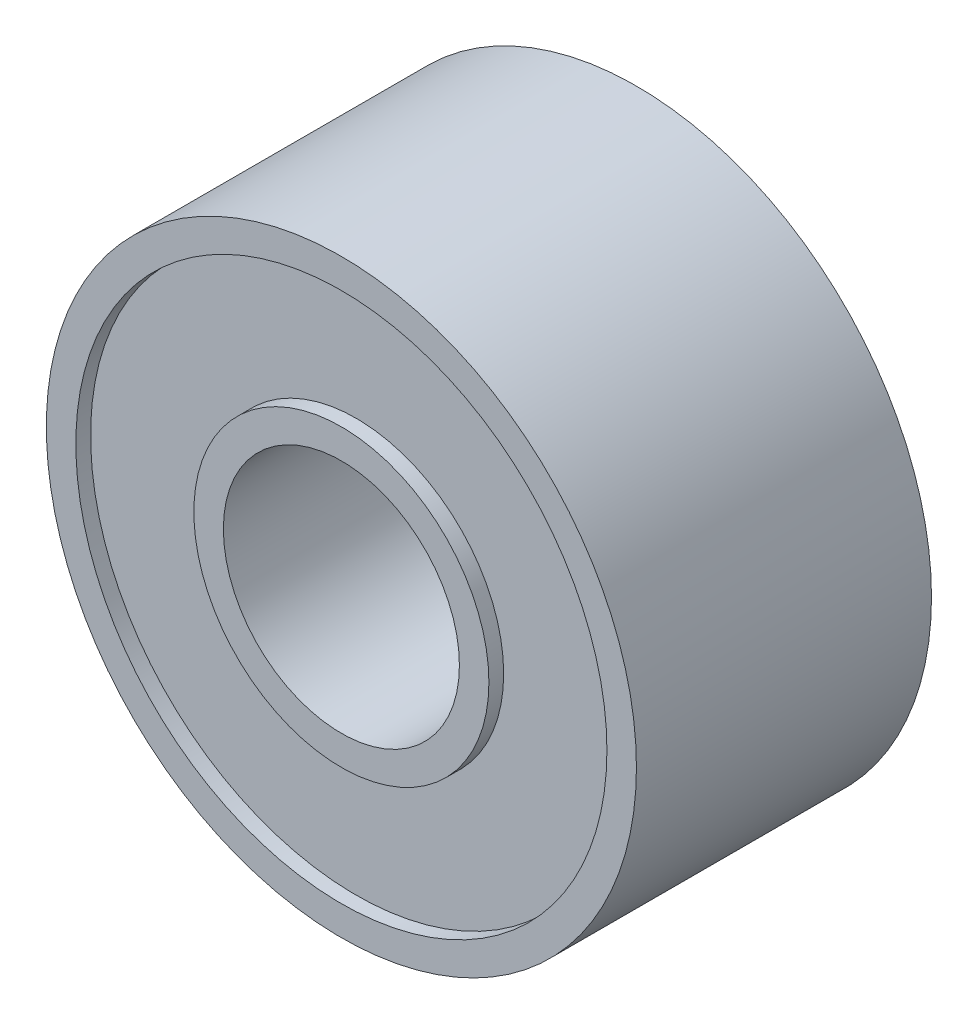
ISO-10303-21;
HEADER;
FILE_DESCRIPTION(('STEP AP214'),'2;1');
FILE_NAME('part.step','',(''),(''),'','','');
FILE_SCHEMA(('AUTOMOTIVE_DESIGN { 1 0 10303 214 1 1 1 1 }'));
ENDSEC;
DATA;
#1=APPLICATION_CONTEXT('core data for automotive mechanical design processes');
#2=APPLICATION_PROTOCOL_DEFINITION('international standard','automotive_design',2000,#1);
#3=PRODUCT_CONTEXT('',#1,'mechanical');
#4=PRODUCT('Part','Part','',(#3));
#5=PRODUCT_RELATED_PRODUCT_CATEGORY('part','',(#4));
#6=PRODUCT_DEFINITION_FORMATION('','',#4);
#7=PRODUCT_DEFINITION_CONTEXT('part definition',#1,'design');
#8=PRODUCT_DEFINITION('design','',#6,#7);
#9=PRODUCT_DEFINITION_SHAPE('','',#8);
#10=(LENGTH_UNIT() NAMED_UNIT(*) SI_UNIT(.MILLI.,.METRE.));
#11=(NAMED_UNIT(*) PLANE_ANGLE_UNIT() SI_UNIT($,.RADIAN.));
#12=(NAMED_UNIT(*) SI_UNIT($,.STERADIAN.) SOLID_ANGLE_UNIT());
#13=UNCERTAINTY_MEASURE_WITH_UNIT(LENGTH_MEASURE(1.E-05),#10,'distance_accuracy_value','');
#14=(GEOMETRIC_REPRESENTATION_CONTEXT(3) GLOBAL_UNCERTAINTY_ASSIGNED_CONTEXT((#13)) GLOBAL_UNIT_ASSIGNED_CONTEXT((#10,
#11,#12)) REPRESENTATION_CONTEXT('',''));
#15=CARTESIAN_POINT('',(0.,0.,0.));
#16=DIRECTION('',(0.,0.,1.));
#17=DIRECTION('',(1.,0.,0.));
#18=AXIS2_PLACEMENT_3D('',#15,#16,#17);
#19=CARTESIAN_POINT('',(0.,0.,4.5));
#20=DIRECTION('',(0.,0.,1.));
#21=DIRECTION('',(1.,0.,0.));
#22=AXIS2_PLACEMENT_3D('',#19,#20,#21);
#23=PLANE('',#22);
#24=CARTESIAN_POINT('',(0.,0.,4.5));
#25=DIRECTION('',(0.,0.,1.));
#26=DIRECTION('',(1.,0.,0.));
#27=AXIS2_PLACEMENT_3D('',#24,#25,#26);
#28=CIRCLE('',#27,5.);
#29=CARTESIAN_POINT('',(5.,0.,4.5));
#30=VERTEX_POINT('',#29);
#31=EDGE_CURVE('E11',#30,#30,#28,.T.);
#32=ORIENTED_EDGE('',*,*,#31,.F.);
#33=EDGE_LOOP('',(#32));
#34=FACE_BOUND('',#33,.T.);
#35=CARTESIAN_POINT('',(0.,0.,4.5));
#36=DIRECTION('',(0.,0.,1.));
#37=DIRECTION('',(1.,0.,0.));
#38=AXIS2_PLACEMENT_3D('',#35,#36,#37);
#39=CIRCLE('',#38,9.);
#40=CARTESIAN_POINT('',(9.,0.,4.5));
#41=VERTEX_POINT('',#40);
#42=EDGE_CURVE('E64',#41,#41,#39,.F.);
#43=ORIENTED_EDGE('',*,*,#42,.F.);
#44=EDGE_LOOP('',(#43));
#45=FACE_BOUND('',#44,.T.);
#46=ADVANCED_FACE('F41',(#34,#45),#23,.T.);
#47=CARTESIAN_POINT('',(0.,0.,-4.5));
#48=DIRECTION('',(0.,0.,1.));
#49=DIRECTION('',(1.,0.,0.));
#50=AXIS2_PLACEMENT_3D('',#47,#48,#49);
#51=PLANE('',#50);
#52=CARTESIAN_POINT('',(0.,0.,-4.5));
#53=DIRECTION('',(0.,0.,1.));
#54=DIRECTION('',(1.,0.,0.));
#55=AXIS2_PLACEMENT_3D('',#52,#53,#54);
#56=CIRCLE('',#55,5.);
#57=CARTESIAN_POINT('',(5.,0.,-4.5));
#58=VERTEX_POINT('',#57);
#59=EDGE_CURVE('E52',#58,#58,#56,.F.);
#60=ORIENTED_EDGE('',*,*,#59,.F.);
#61=EDGE_LOOP('',(#60));
#62=FACE_BOUND('',#61,.T.);
#63=CARTESIAN_POINT('',(0.,0.,-4.5));
#64=DIRECTION('',(0.,0.,1.));
#65=DIRECTION('',(1.,0.,0.));
#66=AXIS2_PLACEMENT_3D('',#63,#64,#65);
#67=CIRCLE('',#66,9.);
#68=CARTESIAN_POINT('',(9.,0.,-4.5));
#69=VERTEX_POINT('',#68);
#70=EDGE_CURVE('E45',#69,#69,#67,.T.);
#71=ORIENTED_EDGE('',*,*,#70,.F.);
#72=EDGE_LOOP('',(#71));
#73=FACE_BOUND('',#72,.T.);
#74=ADVANCED_FACE('F43',(#62,#73),#51,.F.);
#75=CARTESIAN_POINT('',(0.,0.,5.));
#76=DIRECTION('',(0.,0.,-1.));
#77=DIRECTION('',(-1.,0.,0.));
#78=AXIS2_PLACEMENT_3D('',#75,#76,#77);
#79=CYLINDRICAL_SURFACE('',#78,5.);
#80=CARTESIAN_POINT('',(0.,0.,-5.));
#81=DIRECTION('',(0.,0.,1.));
#82=DIRECTION('',(1.,0.,0.));
#83=AXIS2_PLACEMENT_3D('',#80,#81,#82);
#84=CIRCLE('',#83,5.);
#85=CARTESIAN_POINT('',(5.,0.,-5.));
#86=VERTEX_POINT('',#85);
#87=EDGE_CURVE('E57',#86,#86,#84,.T.);
#88=ORIENTED_EDGE('',*,*,#87,.T.);
#89=EDGE_LOOP('',(#88));
#90=FACE_BOUND('',#89,.T.);
#91=ORIENTED_EDGE('',*,*,#59,.T.);
#92=EDGE_LOOP('',(#91));
#93=FACE_BOUND('',#92,.T.);
#94=ADVANCED_FACE('F109',(#90,#93),#79,.T.);
#95=CARTESIAN_POINT('',(0.,0.,5.));
#96=DIRECTION('',(0.,0.,-1.));
#97=DIRECTION('',(-1.,0.,0.));
#98=AXIS2_PLACEMENT_3D('',#95,#96,#97);
#99=CYLINDRICAL_SURFACE('',#98,4.);
#100=CARTESIAN_POINT('',(0.,0.,5.));
#101=DIRECTION('',(0.,0.,1.));
#102=DIRECTION('',(1.,0.,0.));
#103=AXIS2_PLACEMENT_3D('',#100,#101,#102);
#104=CIRCLE('',#103,4.);
#105=CARTESIAN_POINT('',(4.,0.,5.));
#106=VERTEX_POINT('',#105);
#107=EDGE_CURVE('E60',#106,#106,#104,.T.);
#108=ORIENTED_EDGE('',*,*,#107,.T.);
#109=EDGE_LOOP('',(#108));
#110=FACE_BOUND('',#109,.T.);
#111=CARTESIAN_POINT('',(0.,0.,-5.));
#112=DIRECTION('',(0.,0.,1.));
#113=DIRECTION('',(1.,0.,0.));
#114=AXIS2_PLACEMENT_3D('',#111,#112,#113);
#115=CIRCLE('',#114,4.);
#116=CARTESIAN_POINT('',(4.,0.,-5.));
#117=VERTEX_POINT('',#116);
#118=EDGE_CURVE('E61',#117,#117,#115,.T.);
#119=ORIENTED_EDGE('',*,*,#118,.F.);
#120=EDGE_LOOP('',(#119));
#121=FACE_BOUND('',#120,.T.);
#122=ADVANCED_FACE('F113',(#110,#121),#99,.F.);
#123=ORIENTED_EDGE('',*,*,#31,.T.);
#124=EDGE_LOOP('',(#123));
#125=FACE_BOUND('',#124,.T.);
#126=CARTESIAN_POINT('',(0.,0.,5.));
#127=DIRECTION('',(0.,0.,1.));
#128=DIRECTION('',(1.,0.,0.));
#129=AXIS2_PLACEMENT_3D('',#126,#127,#128);
#130=CIRCLE('',#129,5.);
#131=CARTESIAN_POINT('',(5.,0.,5.));
#132=VERTEX_POINT('',#131);
#133=EDGE_CURVE('E56',#132,#132,#130,.T.);
#134=ORIENTED_EDGE('',*,*,#133,.F.);
#135=EDGE_LOOP('',(#134));
#136=FACE_BOUND('',#135,.T.);
#137=ADVANCED_FACE('F116',(#125,#136),#79,.T.);
#138=CARTESIAN_POINT('',(0.,0.,5.));
#139=DIRECTION('',(0.,0.,1.));
#140=DIRECTION('',(1.,0.,0.));
#141=AXIS2_PLACEMENT_3D('',#138,#139,#140);
#142=PLANE('',#141);
#143=ORIENTED_EDGE('',*,*,#107,.F.);
#144=EDGE_LOOP('',(#143));
#145=FACE_BOUND('',#144,.T.);
#146=ORIENTED_EDGE('',*,*,#133,.T.);
#147=EDGE_LOOP('',(#146));
#148=FACE_BOUND('',#147,.T.);
#149=ADVANCED_FACE('F120',(#145,#148),#142,.T.);
#150=CARTESIAN_POINT('',(0.,0.,-5.));
#151=DIRECTION('',(0.,0.,1.));
#152=DIRECTION('',(1.,0.,0.));
#153=AXIS2_PLACEMENT_3D('',#150,#151,#152);
#154=PLANE('',#153);
#155=ORIENTED_EDGE('',*,*,#118,.T.);
#156=EDGE_LOOP('',(#155));
#157=FACE_BOUND('',#156,.T.);
#158=ORIENTED_EDGE('',*,*,#87,.F.);
#159=EDGE_LOOP('',(#158));
#160=FACE_BOUND('',#159,.T.);
#161=ADVANCED_FACE('F121',(#157,#160),#154,.F.);
#162=CARTESIAN_POINT('',(0.,0.,5.));
#163=DIRECTION('',(0.,0.,-1.));
#164=DIRECTION('',(-1.,0.,0.));
#165=AXIS2_PLACEMENT_3D('',#162,#163,#164);
#166=CYLINDRICAL_SURFACE('',#165,9.);
#167=CARTESIAN_POINT('',(0.,0.,-5.));
#168=DIRECTION('',(0.,0.,1.));
#169=DIRECTION('',(1.,0.,0.));
#170=AXIS2_PLACEMENT_3D('',#167,#168,#169);
#171=CIRCLE('',#170,9.);
#172=CARTESIAN_POINT('',(9.,0.,-5.));
#173=VERTEX_POINT('',#172);
#174=EDGE_CURVE('E76',#173,#173,#171,.T.);
#175=ORIENTED_EDGE('',*,*,#174,.F.);
#176=EDGE_LOOP('',(#175));
#177=FACE_BOUND('',#176,.T.);
#178=ORIENTED_EDGE('',*,*,#70,.T.);
#179=EDGE_LOOP('',(#178));
#180=FACE_BOUND('',#179,.T.);
#181=ADVANCED_FACE('F124',(#177,#180),#166,.F.);
#182=ORIENTED_EDGE('',*,*,#42,.T.);
#183=EDGE_LOOP('',(#182));
#184=FACE_BOUND('',#183,.T.);
#185=CARTESIAN_POINT('',(0.,0.,5.));
#186=DIRECTION('',(0.,0.,1.));
#187=DIRECTION('',(1.,0.,0.));
#188=AXIS2_PLACEMENT_3D('',#185,#186,#187);
#189=CIRCLE('',#188,9.);
#190=CARTESIAN_POINT('',(9.,0.,5.));
#191=VERTEX_POINT('',#190);
#192=EDGE_CURVE('E75',#191,#191,#189,.T.);
#193=ORIENTED_EDGE('',*,*,#192,.T.);
#194=EDGE_LOOP('',(#193));
#195=FACE_BOUND('',#194,.T.);
#196=ADVANCED_FACE('F84',(#184,#195),#166,.F.);
#197=CARTESIAN_POINT('',(0.,0.,5.));
#198=DIRECTION('',(0.,0.,-1.));
#199=DIRECTION('',(-1.,0.,0.));
#200=AXIS2_PLACEMENT_3D('',#197,#198,#199);
#201=CYLINDRICAL_SURFACE('',#200,10.);
#202=CARTESIAN_POINT('',(0.,0.,5.));
#203=DIRECTION('',(0.,0.,1.));
#204=DIRECTION('',(1.,0.,0.));
#205=AXIS2_PLACEMENT_3D('',#202,#203,#204);
#206=CIRCLE('',#205,10.);
#207=CARTESIAN_POINT('',(10.,0.,5.));
#208=VERTEX_POINT('',#207);
#209=EDGE_CURVE('E71',#208,#208,#206,.T.);
#210=ORIENTED_EDGE('',*,*,#209,.F.);
#211=EDGE_LOOP('',(#210));
#212=FACE_BOUND('',#211,.T.);
#213=CARTESIAN_POINT('',(0.,0.,-5.));
#214=DIRECTION('',(0.,0.,1.));
#215=DIRECTION('',(1.,0.,0.));
#216=AXIS2_PLACEMENT_3D('',#213,#214,#215);
#217=CIRCLE('',#216,10.);
#218=CARTESIAN_POINT('',(10.,0.,-5.));
#219=VERTEX_POINT('',#218);
#220=EDGE_CURVE('E72',#219,#219,#217,.T.);
#221=ORIENTED_EDGE('',*,*,#220,.T.);
#222=EDGE_LOOP('',(#221));
#223=FACE_BOUND('',#222,.T.);
#224=ADVANCED_FACE('F90',(#212,#223),#201,.T.);
#225=CARTESIAN_POINT('',(0.,0.,5.));
#226=DIRECTION('',(0.,0.,1.));
#227=DIRECTION('',(1.,0.,0.));
#228=AXIS2_PLACEMENT_3D('',#225,#226,#227);
#229=PLANE('',#228);
#230=ORIENTED_EDGE('',*,*,#192,.F.);
#231=EDGE_LOOP('',(#230));
#232=FACE_BOUND('',#231,.T.);
#233=ORIENTED_EDGE('',*,*,#209,.T.);
#234=EDGE_LOOP('',(#233));
#235=FACE_BOUND('',#234,.T.);
#236=ADVANCED_FACE('F86',(#232,#235),#229,.T.);
#237=CARTESIAN_POINT('',(0.,0.,-5.));
#238=DIRECTION('',(0.,0.,1.));
#239=DIRECTION('',(1.,0.,0.));
#240=AXIS2_PLACEMENT_3D('',#237,#238,#239);
#241=PLANE('',#240);
#242=ORIENTED_EDGE('',*,*,#174,.T.);
#243=EDGE_LOOP('',(#242));
#244=FACE_BOUND('',#243,.T.);
#245=ORIENTED_EDGE('',*,*,#220,.F.);
#246=EDGE_LOOP('',(#245));
#247=FACE_BOUND('',#246,.T.);
#248=ADVANCED_FACE('F89',(#244,#247),#241,.F.);
#249=CLOSED_SHELL('',(#46,#74,#94,#122,#137,#149,#161,#181,#196,#224,#236,#248));
#250=MANIFOLD_SOLID_BREP('B2',#249);
#251=ADVANCED_BREP_SHAPE_REPRESENTATION('',(#18,#250),#14);
#252=SHAPE_DEFINITION_REPRESENTATION(#9,#251);
ENDSEC;
END-ISO-10303-21;
